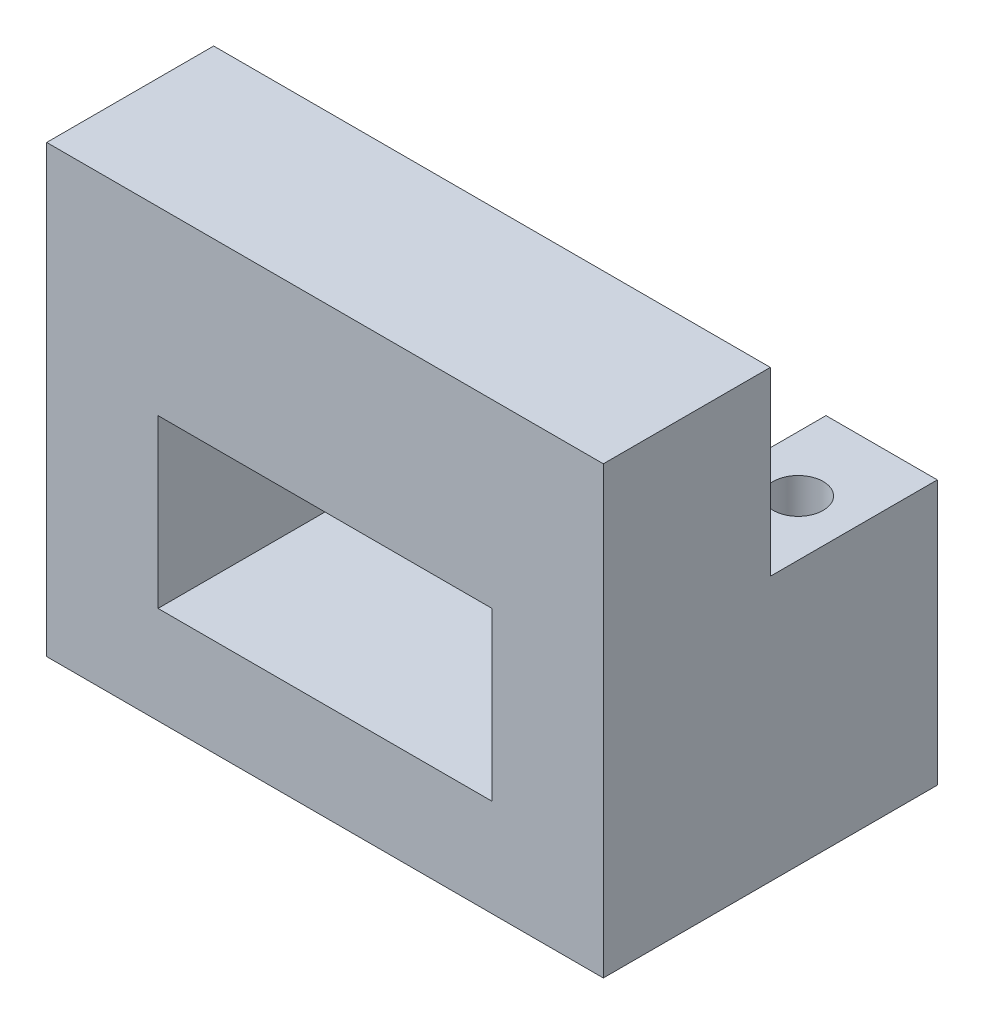
ISO-10303-21;
HEADER;
FILE_DESCRIPTION(('STEP AP214'),'2;1');
FILE_NAME('part.step','',(''),(''),'','','');
FILE_SCHEMA(('AUTOMOTIVE_DESIGN { 1 0 10303 214 1 1 1 1 }'));
ENDSEC;
DATA;
#1=APPLICATION_CONTEXT('core data for automotive mechanical design processes');
#2=APPLICATION_PROTOCOL_DEFINITION('international standard','automotive_design',2000,#1);
#3=PRODUCT_CONTEXT('',#1,'mechanical');
#4=PRODUCT('Part','Part','',(#3));
#5=PRODUCT_RELATED_PRODUCT_CATEGORY('part','',(#4));
#6=PRODUCT_DEFINITION_FORMATION('','',#4);
#7=PRODUCT_DEFINITION_CONTEXT('part definition',#1,'design');
#8=PRODUCT_DEFINITION('design','',#6,#7);
#9=PRODUCT_DEFINITION_SHAPE('','',#8);
#10=(LENGTH_UNIT() NAMED_UNIT(*) SI_UNIT(.MILLI.,.METRE.));
#11=(NAMED_UNIT(*) PLANE_ANGLE_UNIT() SI_UNIT($,.RADIAN.));
#12=(NAMED_UNIT(*) SI_UNIT($,.STERADIAN.) SOLID_ANGLE_UNIT());
#13=UNCERTAINTY_MEASURE_WITH_UNIT(LENGTH_MEASURE(1.E-05),#10,'distance_accuracy_value','');
#14=(GEOMETRIC_REPRESENTATION_CONTEXT(3) GLOBAL_UNCERTAINTY_ASSIGNED_CONTEXT((#13)) GLOBAL_UNIT_ASSIGNED_CONTEXT((#10,
#11,#12)) REPRESENTATION_CONTEXT('',''));
#15=CARTESIAN_POINT('',(0.,0.,0.));
#16=DIRECTION('',(0.,0.,1.));
#17=DIRECTION('',(1.,0.,0.));
#18=AXIS2_PLACEMENT_3D('',#15,#16,#17);
#19=CARTESIAN_POINT('',(50.,7.5,-45.));
#20=DIRECTION('',(0.,1.,0.));
#21=DIRECTION('',(-1.,0.,0.));
#22=AXIS2_PLACEMENT_3D('',#19,#20,#21);
#23=PLANE('',#22);
#24=CARTESIAN_POINT('',(40.,7.50000000000001,-30.));
#25=DIRECTION('',(0.,1.,0.));
#26=DIRECTION('',(-1.,0.,0.));
#27=AXIS2_PLACEMENT_3D('',#24,#25,#26);
#28=CIRCLE('',#27,4.5);
#29=CARTESIAN_POINT('',(35.5,7.50000000000001,-30.));
#30=VERTEX_POINT('',#29);
#31=EDGE_CURVE('E270',#30,#30,#28,.T.);
#32=ORIENTED_EDGE('',*,*,#31,.F.);
#33=EDGE_LOOP('',(#32));
#34=FACE_BOUND('',#33,.T.);
#35=DIRECTION('',(0.,0.,-1.));
#36=VECTOR('',#35,1.);
#37=CARTESIAN_POINT('',(30.,7.50000000000001,39.5));
#38=LINE('',#37,#36);
#39=CARTESIAN_POINT('',(30.,7.50000000000001,-15.));
#40=VERTEX_POINT('',#39);
#41=CARTESIAN_POINT('',(30.,7.50000000000001,-45.));
#42=VERTEX_POINT('',#41);
#43=EDGE_CURVE('E208',#40,#42,#38,.T.);
#44=ORIENTED_EDGE('',*,*,#43,.F.);
#45=DIRECTION('',(-1.,0.,0.));
#46=VECTOR('',#45,1.);
#47=CARTESIAN_POINT('',(50.,7.5,-15.));
#48=LINE('',#47,#46);
#49=CARTESIAN_POINT('',(50.,7.5,-15.));
#50=VERTEX_POINT('',#49);
#51=EDGE_CURVE('E137',#50,#40,#48,.T.);
#52=ORIENTED_EDGE('',*,*,#51,.F.);
#53=DIRECTION('',(0.,0.,1.));
#54=VECTOR('',#53,1.);
#55=CARTESIAN_POINT('',(50.,7.5,-45.));
#56=LINE('',#55,#54);
#57=CARTESIAN_POINT('',(50.,7.5,-45.));
#58=VERTEX_POINT('',#57);
#59=EDGE_CURVE('E155',#58,#50,#56,.T.);
#60=ORIENTED_EDGE('',*,*,#59,.F.);
#61=DIRECTION('',(-1.,0.,0.));
#62=VECTOR('',#61,1.);
#63=CARTESIAN_POINT('',(50.,7.5,-45.));
#64=LINE('',#63,#62);
#65=EDGE_CURVE('E147',#58,#42,#64,.T.);
#66=ORIENTED_EDGE('',*,*,#65,.T.);
#67=EDGE_LOOP('',(#44,#52,#60,#66));
#68=FACE_BOUND('',#67,.T.);
#69=ADVANCED_FACE('F35',(#34,#68),#23,.T.);
#70=CARTESIAN_POINT('',(50.,40.,15.));
#71=DIRECTION('',(-1.,0.,0.));
#72=DIRECTION('',(0.,0.,1.));
#73=AXIS2_PLACEMENT_3D('',#70,#71,#72);
#74=PLANE('',#73);
#75=DIRECTION('',(0.,0.,-1.));
#76=VECTOR('',#75,1.);
#77=CARTESIAN_POINT('',(50.,-40.,15.));
#78=LINE('',#77,#76);
#79=CARTESIAN_POINT('',(50.,-40.,15.));
#80=VERTEX_POINT('',#79);
#81=CARTESIAN_POINT('',(50.,-40.,-45.));
#82=VERTEX_POINT('',#81);
#83=EDGE_CURVE('E173',#80,#82,#78,.T.);
#84=ORIENTED_EDGE('',*,*,#83,.T.);
#85=DIRECTION('',(0.,1.,0.));
#86=VECTOR('',#85,1.);
#87=CARTESIAN_POINT('',(50.,-40.,-45.));
#88=LINE('',#87,#86);
#89=EDGE_CURVE('E143',#82,#58,#88,.T.);
#90=ORIENTED_EDGE('',*,*,#89,.T.);
#91=ORIENTED_EDGE('',*,*,#59,.T.);
#92=DIRECTION('',(0.,1.,0.));
#93=VECTOR('',#92,1.);
#94=CARTESIAN_POINT('',(50.,40.,-15.));
#95=LINE('',#94,#93);
#96=CARTESIAN_POINT('',(50.,40.,-15.));
#97=VERTEX_POINT('',#96);
#98=EDGE_CURVE('E161',#50,#97,#95,.T.);
#99=ORIENTED_EDGE('',*,*,#98,.T.);
#100=DIRECTION('',(0.,0.,-1.));
#101=VECTOR('',#100,1.);
#102=CARTESIAN_POINT('',(50.,40.,15.));
#103=LINE('',#102,#101);
#104=CARTESIAN_POINT('',(50.,40.,15.));
#105=VERTEX_POINT('',#104);
#106=EDGE_CURVE('E185',#105,#97,#103,.T.);
#107=ORIENTED_EDGE('',*,*,#106,.F.);
#108=DIRECTION('',(0.,1.,0.));
#109=VECTOR('',#108,1.);
#110=CARTESIAN_POINT('',(50.,40.,15.));
#111=LINE('',#110,#109);
#112=EDGE_CURVE('E163',#80,#105,#111,.T.);
#113=ORIENTED_EDGE('',*,*,#112,.F.);
#114=EDGE_LOOP('',(#84,#90,#91,#99,#107,#113));
#115=FACE_BOUND('',#114,.T.);
#116=ADVANCED_FACE('F37',(#115),#74,.F.);
#117=CARTESIAN_POINT('',(-50.,40.,15.));
#118=DIRECTION('',(0.,-1.,0.));
#119=DIRECTION('',(0.,0.,-1.));
#120=AXIS2_PLACEMENT_3D('',#117,#118,#119);
#121=PLANE('',#120);
#122=DIRECTION('',(-1.,0.,0.));
#123=VECTOR('',#122,1.);
#124=CARTESIAN_POINT('',(-50.,40.,-15.));
#125=LINE('',#124,#123);
#126=CARTESIAN_POINT('',(-50.,40.,-15.));
#127=VERTEX_POINT('',#126);
#128=EDGE_CURVE('E175',#97,#127,#125,.T.);
#129=ORIENTED_EDGE('',*,*,#128,.T.);
#130=DIRECTION('',(0.,0.,-1.));
#131=VECTOR('',#130,1.);
#132=CARTESIAN_POINT('',(-50.,40.,15.));
#133=LINE('',#132,#131);
#134=CARTESIAN_POINT('',(-50.,40.,15.));
#135=VERTEX_POINT('',#134);
#136=EDGE_CURVE('E182',#135,#127,#133,.T.);
#137=ORIENTED_EDGE('',*,*,#136,.F.);
#138=DIRECTION('',(-1.,0.,0.));
#139=VECTOR('',#138,1.);
#140=CARTESIAN_POINT('',(-50.,40.,15.));
#141=LINE('',#140,#139);
#142=EDGE_CURVE('E166',#105,#135,#141,.T.);
#143=ORIENTED_EDGE('',*,*,#142,.F.);
#144=ORIENTED_EDGE('',*,*,#106,.T.);
#145=EDGE_LOOP('',(#129,#137,#143,#144));
#146=FACE_BOUND('',#145,.T.);
#147=ADVANCED_FACE('F239',(#146),#121,.F.);
#148=CARTESIAN_POINT('',(-50.,40.,15.));
#149=DIRECTION('',(1.,0.,0.));
#150=DIRECTION('',(0.,0.,-1.));
#151=AXIS2_PLACEMENT_3D('',#148,#149,#150);
#152=PLANE('',#151);
#153=DIRECTION('',(0.,-1.,0.));
#154=VECTOR('',#153,1.);
#155=CARTESIAN_POINT('',(-50.,40.,-15.));
#156=LINE('',#155,#154);
#157=CARTESIAN_POINT('',(-50.,7.5,-15.));
#158=VERTEX_POINT('',#157);
#159=EDGE_CURVE('E167',#127,#158,#156,.T.);
#160=ORIENTED_EDGE('',*,*,#159,.T.);
#161=DIRECTION('',(0.,0.,1.));
#162=VECTOR('',#161,1.);
#163=CARTESIAN_POINT('',(-50.,7.49999999999999,-45.));
#164=LINE('',#163,#162);
#165=CARTESIAN_POINT('',(-50.,7.49999999999999,-45.));
#166=VERTEX_POINT('',#165);
#167=EDGE_CURVE('E158',#166,#158,#164,.T.);
#168=ORIENTED_EDGE('',*,*,#167,.F.);
#169=DIRECTION('',(0.,-1.,0.));
#170=VECTOR('',#169,1.);
#171=CARTESIAN_POINT('',(-50.,-40.,-45.));
#172=LINE('',#171,#170);
#173=CARTESIAN_POINT('',(-50.,-40.,-45.));
#174=VERTEX_POINT('',#173);
#175=EDGE_CURVE('E150',#166,#174,#172,.T.);
#176=ORIENTED_EDGE('',*,*,#175,.T.);
#177=DIRECTION('',(0.,0.,-1.));
#178=VECTOR('',#177,1.);
#179=CARTESIAN_POINT('',(-50.,-40.,15.));
#180=LINE('',#179,#178);
#181=CARTESIAN_POINT('',(-50.,-40.,15.));
#182=VERTEX_POINT('',#181);
#183=EDGE_CURVE('E180',#182,#174,#180,.T.);
#184=ORIENTED_EDGE('',*,*,#183,.F.);
#185=DIRECTION('',(0.,-1.,0.));
#186=VECTOR('',#185,1.);
#187=CARTESIAN_POINT('',(-50.,40.,15.));
#188=LINE('',#187,#186);
#189=EDGE_CURVE('E169',#135,#182,#188,.T.);
#190=ORIENTED_EDGE('',*,*,#189,.F.);
#191=ORIENTED_EDGE('',*,*,#136,.T.);
#192=EDGE_LOOP('',(#160,#168,#176,#184,#190,#191));
#193=FACE_BOUND('',#192,.T.);
#194=ADVANCED_FACE('F234',(#193),#152,.F.);
#195=CARTESIAN_POINT('',(-50.,-40.,15.));
#196=DIRECTION('',(0.,1.,0.));
#197=DIRECTION('',(0.,0.,1.));
#198=AXIS2_PLACEMENT_3D('',#195,#196,#197);
#199=PLANE('',#198);
#200=CARTESIAN_POINT('',(40.,-40.,-30.));
#201=DIRECTION('',(0.,-1.,0.));
#202=DIRECTION('',(0.,0.,-1.));
#203=AXIS2_PLACEMENT_3D('',#200,#201,#202);
#204=CIRCLE('',#203,4.5);
#205=CARTESIAN_POINT('',(40.,-40.,-34.5));
#206=VERTEX_POINT('',#205);
#207=EDGE_CURVE('E274',#206,#206,#204,.T.);
#208=ORIENTED_EDGE('',*,*,#207,.F.);
#209=EDGE_LOOP('',(#208));
#210=FACE_BOUND('',#209,.T.);
#211=CARTESIAN_POINT('',(-40.,-40.,-30.));
#212=DIRECTION('',(0.,-1.,0.));
#213=DIRECTION('',(0.,0.,-1.));
#214=AXIS2_PLACEMENT_3D('',#211,#212,#213);
#215=CIRCLE('',#214,4.5);
#216=CARTESIAN_POINT('',(-40.,-40.,-34.5));
#217=VERTEX_POINT('',#216);
#218=EDGE_CURVE('E268',#217,#217,#215,.T.);
#219=ORIENTED_EDGE('',*,*,#218,.F.);
#220=EDGE_LOOP('',(#219));
#221=FACE_BOUND('',#220,.T.);
#222=ORIENTED_EDGE('',*,*,#183,.T.);
#223=DIRECTION('',(1.,0.,0.));
#224=VECTOR('',#223,1.);
#225=CARTESIAN_POINT('',(50.,-40.,-45.));
#226=LINE('',#225,#224);
#227=EDGE_CURVE('E153',#174,#82,#226,.T.);
#228=ORIENTED_EDGE('',*,*,#227,.T.);
#229=ORIENTED_EDGE('',*,*,#83,.F.);
#230=DIRECTION('',(1.,0.,0.));
#231=VECTOR('',#230,1.);
#232=CARTESIAN_POINT('',(-50.,-40.,15.));
#233=LINE('',#232,#231);
#234=EDGE_CURVE('E171',#182,#80,#233,.T.);
#235=ORIENTED_EDGE('',*,*,#234,.F.);
#236=EDGE_LOOP('',(#222,#228,#229,#235));
#237=FACE_BOUND('',#236,.T.);
#238=ADVANCED_FACE('F231',(#210,#221,#237),#199,.F.);
#239=CARTESIAN_POINT('',(0.,0.,15.));
#240=DIRECTION('',(0.,0.,1.));
#241=DIRECTION('',(1.,0.,0.));
#242=AXIS2_PLACEMENT_3D('',#239,#240,#241);
#243=PLANE('',#242);
#244=DIRECTION('',(0.,1.,0.));
#245=VECTOR('',#244,1.);
#246=CARTESIAN_POINT('',(30.,0.,15.));
#247=LINE('',#246,#245);
#248=CARTESIAN_POINT('',(30.,-22.5,15.));
#249=VERTEX_POINT('',#248);
#250=CARTESIAN_POINT('',(30.,7.50000000000001,15.));
#251=VERTEX_POINT('',#250);
#252=EDGE_CURVE('E127',#249,#251,#247,.T.);
#253=ORIENTED_EDGE('',*,*,#252,.F.);
#254=DIRECTION('',(1.,0.,0.));
#255=VECTOR('',#254,1.);
#256=CARTESIAN_POINT('',(0.,-22.5,15.));
#257=LINE('',#256,#255);
#258=CARTESIAN_POINT('',(-29.9999999999997,-22.5,15.));
#259=VERTEX_POINT('',#258);
#260=EDGE_CURVE('E116',#259,#249,#257,.T.);
#261=ORIENTED_EDGE('',*,*,#260,.F.);
#262=DIRECTION('',(0.,-1.,0.));
#263=VECTOR('',#262,1.);
#264=CARTESIAN_POINT('',(-29.9999999999997,0.,15.));
#265=LINE('',#264,#263);
#266=CARTESIAN_POINT('',(-29.9999999999997,7.50000000000001,15.));
#267=VERTEX_POINT('',#266);
#268=EDGE_CURVE('E121',#267,#259,#265,.T.);
#269=ORIENTED_EDGE('',*,*,#268,.F.);
#270=DIRECTION('',(-1.,0.,0.));
#271=VECTOR('',#270,1.);
#272=CARTESIAN_POINT('',(0.,7.50000000000001,15.));
#273=LINE('',#272,#271);
#274=EDGE_CURVE('E134',#251,#267,#273,.T.);
#275=ORIENTED_EDGE('',*,*,#274,.F.);
#276=EDGE_LOOP('',(#253,#261,#269,#275));
#277=FACE_BOUND('',#276,.T.);
#278=ORIENTED_EDGE('',*,*,#112,.T.);
#279=ORIENTED_EDGE('',*,*,#142,.T.);
#280=ORIENTED_EDGE('',*,*,#189,.T.);
#281=ORIENTED_EDGE('',*,*,#234,.T.);
#282=EDGE_LOOP('',(#278,#279,#280,#281));
#283=FACE_BOUND('',#282,.T.);
#284=ADVANCED_FACE('F132',(#277,#283),#243,.T.);
#285=CARTESIAN_POINT('',(0.,0.,-15.));
#286=DIRECTION('',(0.,0.,1.));
#287=DIRECTION('',(1.,0.,0.));
#288=AXIS2_PLACEMENT_3D('',#285,#286,#287);
#289=PLANE('',#288);
#290=ORIENTED_EDGE('',*,*,#98,.F.);
#291=ORIENTED_EDGE('',*,*,#51,.T.);
#292=DIRECTION('',(-1.,0.,0.));
#293=VECTOR('',#292,1.);
#294=CARTESIAN_POINT('',(0.,7.50000000000001,-15.));
#295=LINE('',#294,#293);
#296=CARTESIAN_POINT('',(-29.9999999999997,7.50000000000001,-15.));
#297=VERTEX_POINT('',#296);
#298=EDGE_CURVE('E139',#40,#297,#295,.T.);
#299=ORIENTED_EDGE('',*,*,#298,.T.);
#300=EDGE_CURVE('E135',#297,#158,#48,.T.);
#301=ORIENTED_EDGE('',*,*,#300,.T.);
#302=ORIENTED_EDGE('',*,*,#159,.F.);
#303=ORIENTED_EDGE('',*,*,#128,.F.);
#304=EDGE_LOOP('',(#290,#291,#299,#301,#302,#303));
#305=FACE_BOUND('',#304,.T.);
#306=ADVANCED_FACE('F215',(#305),#289,.F.);
#307=CARTESIAN_POINT('',(-40.,7.5,-30.));
#308=DIRECTION('',(0.,1.,0.));
#309=DIRECTION('',(-1.,0.,0.));
#310=AXIS2_PLACEMENT_3D('',#307,#308,#309);
#311=CIRCLE('',#310,4.5);
#312=CARTESIAN_POINT('',(-44.5,7.5,-30.));
#313=VERTEX_POINT('',#312);
#314=EDGE_CURVE('E39',#313,#313,#311,.T.);
#315=ORIENTED_EDGE('',*,*,#314,.F.);
#316=EDGE_LOOP('',(#315));
#317=FACE_BOUND('',#316,.T.);
#318=DIRECTION('',(0.,0.,-1.));
#319=VECTOR('',#318,1.);
#320=CARTESIAN_POINT('',(-29.9999999999997,7.50000000000001,39.5));
#321=LINE('',#320,#319);
#322=CARTESIAN_POINT('',(-29.9999999999997,7.50000000000001,-45.));
#323=VERTEX_POINT('',#322);
#324=EDGE_CURVE('E199',#297,#323,#321,.T.);
#325=ORIENTED_EDGE('',*,*,#324,.T.);
#326=EDGE_CURVE('E146',#323,#166,#64,.T.);
#327=ORIENTED_EDGE('',*,*,#326,.T.);
#328=ORIENTED_EDGE('',*,*,#167,.T.);
#329=ORIENTED_EDGE('',*,*,#300,.F.);
#330=EDGE_LOOP('',(#325,#327,#328,#329));
#331=FACE_BOUND('',#330,.T.);
#332=ADVANCED_FACE('F203',(#317,#331),#23,.T.);
#333=CARTESIAN_POINT('',(0.,0.,-45.));
#334=DIRECTION('',(0.,0.,1.));
#335=DIRECTION('',(1.,0.,0.));
#336=AXIS2_PLACEMENT_3D('',#333,#334,#335);
#337=PLANE('',#336);
#338=DIRECTION('',(1.,0.,0.));
#339=VECTOR('',#338,1.);
#340=CARTESIAN_POINT('',(0.,-22.5,-45.));
#341=LINE('',#340,#339);
#342=CARTESIAN_POINT('',(-29.9999999999997,-22.5,-45.));
#343=VERTEX_POINT('',#342);
#344=CARTESIAN_POINT('',(30.,-22.5,-45.));
#345=VERTEX_POINT('',#344);
#346=EDGE_CURVE('E188',#343,#345,#341,.T.);
#347=ORIENTED_EDGE('',*,*,#346,.T.);
#348=DIRECTION('',(0.,1.,0.));
#349=VECTOR('',#348,1.);
#350=CARTESIAN_POINT('',(30.,0.,-45.));
#351=LINE('',#350,#349);
#352=EDGE_CURVE('E11',#345,#42,#351,.T.);
#353=ORIENTED_EDGE('',*,*,#352,.T.);
#354=ORIENTED_EDGE('',*,*,#65,.F.);
#355=ORIENTED_EDGE('',*,*,#89,.F.);
#356=ORIENTED_EDGE('',*,*,#227,.F.);
#357=ORIENTED_EDGE('',*,*,#175,.F.);
#358=ORIENTED_EDGE('',*,*,#326,.F.);
#359=DIRECTION('',(0.,-1.,0.));
#360=VECTOR('',#359,1.);
#361=CARTESIAN_POINT('',(-29.9999999999997,0.,-45.));
#362=LINE('',#361,#360);
#363=EDGE_CURVE('E44',#323,#343,#362,.T.);
#364=ORIENTED_EDGE('',*,*,#363,.T.);
#365=EDGE_LOOP('',(#347,#353,#354,#355,#356,#357,#358,#364));
#366=FACE_BOUND('',#365,.T.);
#367=ADVANCED_FACE('F193',(#366),#337,.F.);
#368=CARTESIAN_POINT('',(30.,-22.5,39.5));
#369=DIRECTION('',(1.,0.,0.));
#370=DIRECTION('',(0.,0.,-1.));
#371=AXIS2_PLACEMENT_3D('',#368,#369,#370);
#372=PLANE('',#371);
#373=ORIENTED_EDGE('',*,*,#252,.T.);
#374=EDGE_CURVE('E122',#251,#40,#38,.T.);
#375=ORIENTED_EDGE('',*,*,#374,.T.);
#376=ORIENTED_EDGE('',*,*,#43,.T.);
#377=ORIENTED_EDGE('',*,*,#352,.F.);
#378=DIRECTION('',(0.,0.,-1.));
#379=VECTOR('',#378,1.);
#380=CARTESIAN_POINT('',(30.,-22.5,39.5));
#381=LINE('',#380,#379);
#382=EDGE_CURVE('E56',#249,#345,#381,.T.);
#383=ORIENTED_EDGE('',*,*,#382,.F.);
#384=EDGE_LOOP('',(#373,#375,#376,#377,#383));
#385=FACE_BOUND('',#384,.T.);
#386=ADVANCED_FACE('F125',(#385),#372,.F.);
#387=CARTESIAN_POINT('',(-29.9999999999997,7.50000000000001,39.5));
#388=DIRECTION('',(0.,1.,0.));
#389=DIRECTION('',(-1.,0.,0.));
#390=AXIS2_PLACEMENT_3D('',#387,#388,#389);
#391=PLANE('',#390);
#392=ORIENTED_EDGE('',*,*,#274,.T.);
#393=EDGE_CURVE('E206',#267,#297,#321,.T.);
#394=ORIENTED_EDGE('',*,*,#393,.T.);
#395=ORIENTED_EDGE('',*,*,#298,.F.);
#396=ORIENTED_EDGE('',*,*,#374,.F.);
#397=EDGE_LOOP('',(#392,#394,#395,#396));
#398=FACE_BOUND('',#397,.T.);
#399=ADVANCED_FACE('F219',(#398),#391,.F.);
#400=CARTESIAN_POINT('',(-29.9999999999997,-22.5,39.5));
#401=DIRECTION('',(-1.,0.,0.));
#402=DIRECTION('',(0.,0.,1.));
#403=AXIS2_PLACEMENT_3D('',#400,#401,#402);
#404=PLANE('',#403);
#405=ORIENTED_EDGE('',*,*,#268,.T.);
#406=DIRECTION('',(0.,0.,-1.));
#407=VECTOR('',#406,1.);
#408=CARTESIAN_POINT('',(-29.9999999999997,-22.5,39.5));
#409=LINE('',#408,#407);
#410=EDGE_CURVE('E51',#259,#343,#409,.T.);
#411=ORIENTED_EDGE('',*,*,#410,.T.);
#412=ORIENTED_EDGE('',*,*,#363,.F.);
#413=ORIENTED_EDGE('',*,*,#324,.F.);
#414=ORIENTED_EDGE('',*,*,#393,.F.);
#415=EDGE_LOOP('',(#405,#411,#412,#413,#414));
#416=FACE_BOUND('',#415,.T.);
#417=ADVANCED_FACE('F197',(#416),#404,.F.);
#418=CARTESIAN_POINT('',(-29.9999999999997,-22.5,39.5));
#419=DIRECTION('',(0.,-1.,0.));
#420=DIRECTION('',(1.,0.,0.));
#421=AXIS2_PLACEMENT_3D('',#418,#419,#420);
#422=PLANE('',#421);
#423=ORIENTED_EDGE('',*,*,#260,.T.);
#424=ORIENTED_EDGE('',*,*,#382,.T.);
#425=ORIENTED_EDGE('',*,*,#346,.F.);
#426=ORIENTED_EDGE('',*,*,#410,.F.);
#427=EDGE_LOOP('',(#423,#424,#425,#426));
#428=FACE_BOUND('',#427,.T.);
#429=ADVANCED_FACE('F117',(#428),#422,.F.);
#430=CARTESIAN_POINT('',(-40.,40.,-30.));
#431=DIRECTION('',(0.,-1.,0.));
#432=DIRECTION('',(0.,0.,-1.));
#433=AXIS2_PLACEMENT_3D('',#430,#431,#432);
#434=CYLINDRICAL_SURFACE('',#433,4.5);
#435=ORIENTED_EDGE('',*,*,#314,.T.);
#436=EDGE_LOOP('',(#435));
#437=FACE_BOUND('',#436,.T.);
#438=ORIENTED_EDGE('',*,*,#218,.T.);
#439=EDGE_LOOP('',(#438));
#440=FACE_BOUND('',#439,.T.);
#441=ADVANCED_FACE('F283',(#437,#440),#434,.F.);
#442=CARTESIAN_POINT('',(40.,40.,-30.));
#443=DIRECTION('',(0.,-1.,0.));
#444=DIRECTION('',(0.,0.,-1.));
#445=AXIS2_PLACEMENT_3D('',#442,#443,#444);
#446=CYLINDRICAL_SURFACE('',#445,4.5);
#447=ORIENTED_EDGE('',*,*,#31,.T.);
#448=EDGE_LOOP('',(#447));
#449=FACE_BOUND('',#448,.T.);
#450=ORIENTED_EDGE('',*,*,#207,.T.);
#451=EDGE_LOOP('',(#450));
#452=FACE_BOUND('',#451,.T.);
#453=ADVANCED_FACE('F280',(#449,#452),#446,.F.);
#454=CLOSED_SHELL('',(#69,#116,#147,#194,#238,#284,#306,#332,#367,#386,#399,#417,#429,#441,#453));
#455=MANIFOLD_SOLID_BREP('B2',#454);
#456=ADVANCED_BREP_SHAPE_REPRESENTATION('',(#18,#455),#14);
#457=SHAPE_DEFINITION_REPRESENTATION(#9,#456);
ENDSEC;
END-ISO-10303-21;
